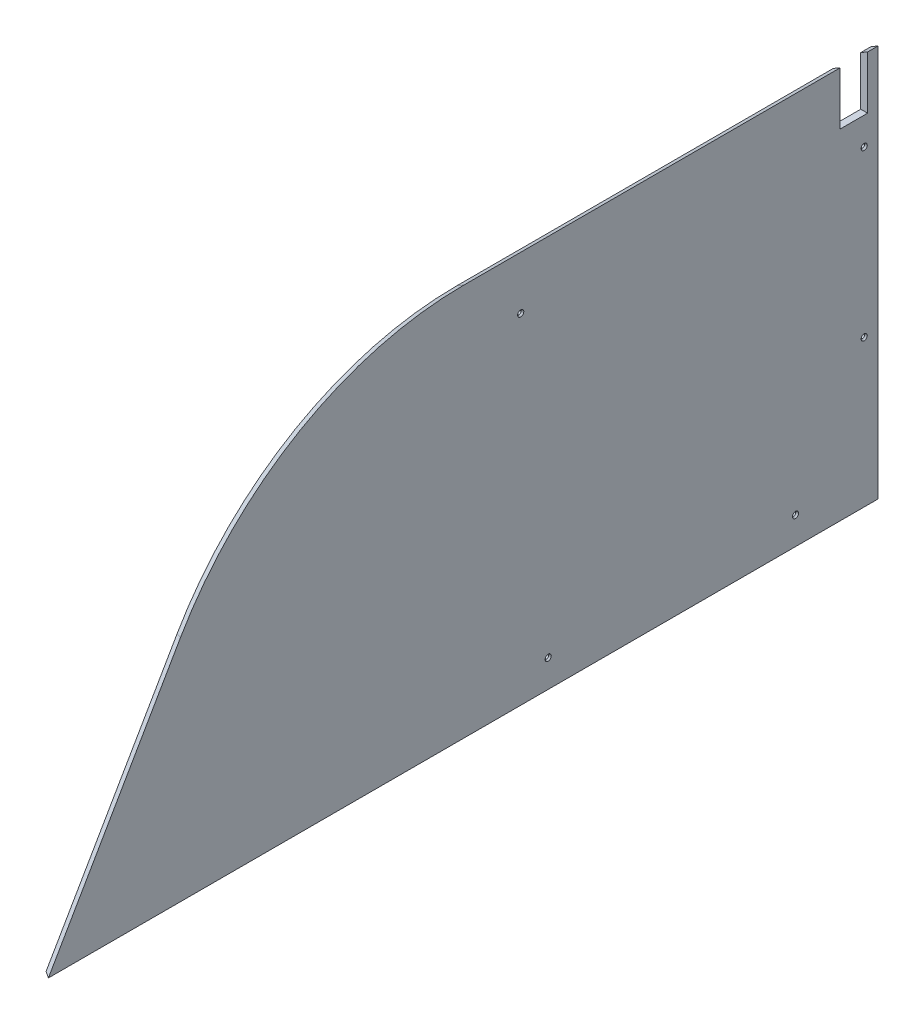
ISO-10303-21;
HEADER;
FILE_DESCRIPTION(('STEP AP214'),'2;1');
FILE_NAME('part.step','',(''),(''),'','','');
FILE_SCHEMA(('AUTOMOTIVE_DESIGN { 1 0 10303 214 1 1 1 1 }'));
ENDSEC;
DATA;
#1=APPLICATION_CONTEXT('core data for automotive mechanical design processes');
#2=APPLICATION_PROTOCOL_DEFINITION('international standard','automotive_design',2000,#1);
#3=PRODUCT_CONTEXT('',#1,'mechanical');
#4=PRODUCT('Part','Part','',(#3));
#5=PRODUCT_RELATED_PRODUCT_CATEGORY('part','',(#4));
#6=PRODUCT_DEFINITION_FORMATION('','',#4);
#7=PRODUCT_DEFINITION_CONTEXT('part definition',#1,'design');
#8=PRODUCT_DEFINITION('design','',#6,#7);
#9=PRODUCT_DEFINITION_SHAPE('','',#8);
#10=(LENGTH_UNIT() NAMED_UNIT(*) SI_UNIT(.MILLI.,.METRE.));
#11=(NAMED_UNIT(*) PLANE_ANGLE_UNIT() SI_UNIT($,.RADIAN.));
#12=(NAMED_UNIT(*) SI_UNIT($,.STERADIAN.) SOLID_ANGLE_UNIT());
#13=UNCERTAINTY_MEASURE_WITH_UNIT(LENGTH_MEASURE(1.E-05),#10,'distance_accuracy_value','');
#14=(GEOMETRIC_REPRESENTATION_CONTEXT(3) GLOBAL_UNCERTAINTY_ASSIGNED_CONTEXT((#13)) GLOBAL_UNIT_ASSIGNED_CONTEXT((#10,
#11,#12)) REPRESENTATION_CONTEXT('',''));
#15=CARTESIAN_POINT('',(0.,0.,0.));
#16=DIRECTION('',(0.,0.,1.));
#17=DIRECTION('',(1.,0.,0.));
#18=AXIS2_PLACEMENT_3D('',#15,#16,#17);
#19=CARTESIAN_POINT('',(10.5585817229401,258.962388375395,-263.265451077908));
#20=DIRECTION('',(-0.499999999999998,0.86602540378444,0.));
#21=DIRECTION('',(0.,0.,-1.));
#22=AXIS2_PLACEMENT_3D('',#19,#20,#21);
#23=PLANE('',#22);
#24=DIRECTION('',(0.86602540378444,0.499999999999998,0.));
#25=VECTOR('',#24,1.);
#26=CARTESIAN_POINT('',(1.58674999999998,253.782498915031,-636.56408902891));
#27=LINE('',#26,#25);
#28=CARTESIAN_POINT('',(0.,252.866388375395,-636.56408902891));
#29=VERTEX_POINT('',#28);
#30=CARTESIAN_POINT('',(6.35,256.532562584749,-636.56408902891));
#31=VERTEX_POINT('',#30);
#32=EDGE_CURVE('E109',#29,#31,#27,.T.);
#33=ORIENTED_EDGE('',*,*,#32,.T.);
#34=DIRECTION('',(0.,0.,1.));
#35=VECTOR('',#34,1.);
#36=CARTESIAN_POINT('',(6.35,256.532562584749,-263.265451077908));
#37=LINE('',#36,#35);
#38=CARTESIAN_POINT('',(6.35,256.532562584749,-646.08908902891));
#39=VERTEX_POINT('',#38);
#40=EDGE_CURVE('E190',#39,#31,#37,.T.);
#41=ORIENTED_EDGE('',*,*,#40,.F.);
#42=DIRECTION('',(0.86602540378444,0.499999999999998,0.));
#43=VECTOR('',#42,1.);
#44=CARTESIAN_POINT('',(10.5585817229401,258.962388375395,-646.08908902891));
#45=LINE('',#44,#43);
#46=CARTESIAN_POINT('',(0.,252.866388375395,-646.08908902891));
#47=VERTEX_POINT('',#46);
#48=EDGE_CURVE('E11',#47,#39,#45,.T.);
#49=ORIENTED_EDGE('',*,*,#48,.F.);
#50=DIRECTION('',(0.,0.,-1.));
#51=VECTOR('',#50,1.);
#52=CARTESIAN_POINT('',(0.,252.866388375395,-646.08908902891));
#53=LINE('',#52,#51);
#54=EDGE_CURVE('E128',#29,#47,#53,.T.);
#55=ORIENTED_EDGE('',*,*,#54,.F.);
#56=EDGE_LOOP('',(#33,#41,#49,#55));
#57=FACE_BOUND('',#56,.T.);
#58=ADVANCED_FACE('F35',(#57),#23,.T.);
#59=CARTESIAN_POINT('',(6.35,-106.162611624605,123.515928008951));
#60=DIRECTION('',(0.,1.,0.));
#61=DIRECTION('',(0.,0.,1.));
#62=AXIS2_PLACEMENT_3D('',#59,#60,#61);
#63=PLANE('',#62);
#64=DIRECTION('',(0.,0.,-1.));
#65=VECTOR('',#64,1.);
#66=CARTESIAN_POINT('',(6.35,-106.162611624605,123.515928008951));
#67=LINE('',#66,#65);
#68=CARTESIAN_POINT('',(6.35,-106.162611624605,120.710206860324));
#69=VERTEX_POINT('',#68);
#70=CARTESIAN_POINT('',(6.35,-106.162611624605,-646.08908902891));
#71=VERTEX_POINT('',#70);
#72=EDGE_CURVE('E178',#69,#71,#67,.T.);
#73=ORIENTED_EDGE('',*,*,#72,.F.);
#74=DIRECTION('',(-0.832050294337845,0.,-0.554700196225227));
#75=VECTOR('',#74,1.);
#76=CARTESIAN_POINT('',(10.5585817229401,-106.162611624605,123.515928008951));
#77=LINE('',#76,#75);
#78=CARTESIAN_POINT('',(0.,-106.162611624605,116.476873526991));
#79=VERTEX_POINT('',#78);
#80=EDGE_CURVE('E133',#69,#79,#77,.T.);
#81=ORIENTED_EDGE('',*,*,#80,.T.);
#82=DIRECTION('',(0.,0.,-1.));
#83=VECTOR('',#82,1.);
#84=CARTESIAN_POINT('',(0.,-106.162611624605,123.515928008951));
#85=LINE('',#84,#83);
#86=CARTESIAN_POINT('',(0.,-106.162611624605,-646.08908902891));
#87=VERTEX_POINT('',#86);
#88=EDGE_CURVE('E177',#79,#87,#85,.T.);
#89=ORIENTED_EDGE('',*,*,#88,.T.);
#90=DIRECTION('',(-1.,0.,0.));
#91=VECTOR('',#90,1.);
#92=CARTESIAN_POINT('',(6.35,-106.162611624605,-646.08908902891));
#93=LINE('',#92,#91);
#94=EDGE_CURVE('E184',#71,#87,#93,.T.);
#95=ORIENTED_EDGE('',*,*,#94,.F.);
#96=EDGE_LOOP('',(#73,#81,#89,#95));
#97=FACE_BOUND('',#96,.T.);
#98=ADVANCED_FACE('F200',(#97),#63,.F.);
#99=CARTESIAN_POINT('',(6.35,258.962388375395,-646.08908902891));
#100=DIRECTION('',(0.,0.,1.));
#101=DIRECTION('',(1.,0.,0.));
#102=AXIS2_PLACEMENT_3D('',#99,#100,#101);
#103=PLANE('',#102);
#104=DIRECTION('',(0.,1.,0.));
#105=VECTOR('',#104,1.);
#106=CARTESIAN_POINT('',(0.,258.962388375395,-646.08908902891));
#107=LINE('',#106,#105);
#108=EDGE_CURVE('E181',#87,#47,#107,.T.);
#109=ORIENTED_EDGE('',*,*,#108,.T.);
#110=ORIENTED_EDGE('',*,*,#48,.T.);
#111=DIRECTION('',(0.,1.,0.));
#112=VECTOR('',#111,1.);
#113=CARTESIAN_POINT('',(6.35,258.962388375395,-646.08908902891));
#114=LINE('',#113,#112);
#115=EDGE_CURVE('E180',#71,#39,#114,.T.);
#116=ORIENTED_EDGE('',*,*,#115,.F.);
#117=ORIENTED_EDGE('',*,*,#94,.T.);
#118=EDGE_LOOP('',(#109,#110,#116,#117));
#119=FACE_BOUND('',#118,.T.);
#120=ADVANCED_FACE('F206',(#119),#103,.F.);
#121=CARTESIAN_POINT('',(6.35,-45.837611624606,-263.265451077908));
#122=DIRECTION('',(-1.,0.,0.));
#123=DIRECTION('',(0.,0.,1.));
#124=AXIS2_PLACEMENT_3D('',#121,#122,#123);
#125=PLANE('',#124);
#126=CARTESIAN_POINT('',(6.35,-80.7626116246052,-569.88908902891));
#127=DIRECTION('',(1.,0.,0.));
#128=DIRECTION('',(0.,0.,-1.));
#129=AXIS2_PLACEMENT_3D('',#126,#127,#128);
#130=CIRCLE('',#129,2.8575);
#131=CARTESIAN_POINT('',(6.35,-80.7626116246052,-572.74658902891));
#132=VERTEX_POINT('',#131);
#133=EDGE_CURVE('E300',#132,#132,#130,.T.);
#134=ORIENTED_EDGE('',*,*,#133,.F.);
#135=EDGE_LOOP('',(#134));
#136=FACE_BOUND('',#135,.T.);
#137=CARTESIAN_POINT('',(6.35,-80.7626116246052,-341.28908902891));
#138=DIRECTION('',(1.,0.,0.));
#139=DIRECTION('',(0.,0.,-1.));
#140=AXIS2_PLACEMENT_3D('',#137,#138,#139);
#141=CIRCLE('',#140,2.8575);
#142=CARTESIAN_POINT('',(6.35,-80.7626116246052,-344.14658902891));
#143=VERTEX_POINT('',#142);
#144=EDGE_CURVE('E307',#143,#143,#141,.T.);
#145=ORIENTED_EDGE('',*,*,#144,.F.);
#146=EDGE_LOOP('',(#145));
#147=FACE_BOUND('',#146,.T.);
#148=CARTESIAN_POINT('',(6.35,207.527388375395,-315.88908902891));
#149=DIRECTION('',(1.,0.,0.));
#150=DIRECTION('',(0.,0.,-1.));
#151=AXIS2_PLACEMENT_3D('',#148,#149,#150);
#152=CIRCLE('',#151,2.85750000000001);
#153=CARTESIAN_POINT('',(6.35,207.527388375395,-318.74658902891));
#154=VERTEX_POINT('',#153);
#155=EDGE_CURVE('E144',#154,#154,#152,.T.);
#156=ORIENTED_EDGE('',*,*,#155,.F.);
#157=EDGE_LOOP('',(#156));
#158=FACE_BOUND('',#157,.T.);
#159=CARTESIAN_POINT('',(6.35,182.127388375395,-633.38908902891));
#160=DIRECTION('',(1.,0.,0.));
#161=DIRECTION('',(0.,0.,-1.));
#162=AXIS2_PLACEMENT_3D('',#159,#160,#161);
#163=CIRCLE('',#162,2.85750000000001);
#164=CARTESIAN_POINT('',(6.35,182.127388375395,-636.24658902891));
#165=VERTEX_POINT('',#164);
#166=EDGE_CURVE('E159',#165,#165,#163,.T.);
#167=ORIENTED_EDGE('',*,*,#166,.F.);
#168=EDGE_LOOP('',(#167));
#169=FACE_BOUND('',#168,.T.);
#170=CARTESIAN_POINT('',(6.35,29.7273883753948,-633.38908902891));
#171=DIRECTION('',(1.,0.,0.));
#172=DIRECTION('',(0.,0.,-1.));
#173=AXIS2_PLACEMENT_3D('',#170,#171,#172);
#174=CIRCLE('',#173,2.8575);
#175=CARTESIAN_POINT('',(6.35,29.7273883753948,-636.24658902891));
#176=VERTEX_POINT('',#175);
#177=EDGE_CURVE('E168',#176,#176,#174,.T.);
#178=ORIENTED_EDGE('',*,*,#177,.F.);
#179=EDGE_LOOP('',(#178));
#180=FACE_BOUND('',#179,.T.);
#181=ORIENTED_EDGE('',*,*,#40,.T.);
#182=DIRECTION('',(0.,1.,0.));
#183=VECTOR('',#182,1.);
#184=CARTESIAN_POINT('',(6.35,256.532562584749,-636.56408902891));
#185=LINE('',#184,#183);
#186=CARTESIAN_POINT('',(6.35,207.527388375395,-636.56408902891));
#187=VERTEX_POINT('',#186);
#188=EDGE_CURVE('E115',#187,#31,#185,.T.);
#189=ORIENTED_EDGE('',*,*,#188,.F.);
#190=DIRECTION('',(0.,0.,-1.));
#191=VECTOR('',#190,1.);
#192=CARTESIAN_POINT('',(6.35,207.527388375395,-636.56408902891));
#193=LINE('',#192,#191);
#194=CARTESIAN_POINT('',(6.35,207.527388375395,-611.16408902891));
#195=VERTEX_POINT('',#194);
#196=EDGE_CURVE('E210',#195,#187,#193,.T.);
#197=ORIENTED_EDGE('',*,*,#196,.F.);
#198=DIRECTION('',(0.,-1.,0.));
#199=VECTOR('',#198,1.);
#200=CARTESIAN_POINT('',(6.35,256.532562584749,-611.16408902891));
#201=LINE('',#200,#199);
#202=CARTESIAN_POINT('',(6.35,256.532562584749,-611.16408902891));
#203=VERTEX_POINT('',#202);
#204=EDGE_CURVE('E211',#203,#195,#201,.T.);
#205=ORIENTED_EDGE('',*,*,#204,.F.);
#206=CARTESIAN_POINT('',(6.35,256.532562584749,-263.265451077908));
#207=VERTEX_POINT('',#206);
#208=EDGE_CURVE('E189',#203,#207,#37,.T.);
#209=ORIENTED_EDGE('',*,*,#208,.T.);
#210=CARTESIAN_POINT('',(6.35,-45.837611624606,-263.265451077908));
#211=DIRECTION('',(-1.,0.,0.));
#212=DIRECTION('',(0.,0.,1.));
#213=AXIS2_PLACEMENT_3D('',#210,#211,#212);
#214=CIRCLE('',#213,302.370174209355);
#215=CARTESIAN_POINT('',(6.35,105.347475480071,-1.40519886588096));
#216=VERTEX_POINT('',#215);
#217=EDGE_CURVE('E192',#207,#216,#214,.F.);
#218=ORIENTED_EDGE('',*,*,#217,.T.);
#219=DIRECTION('',(0.,-0.86602540378444,0.499999999999998));
#220=VECTOR('',#219,1.);
#221=CARTESIAN_POINT('',(6.35,-107.377524519928,121.411637147481));
#222=LINE('',#221,#220);
#223=EDGE_CURVE('E137',#216,#69,#222,.T.);
#224=ORIENTED_EDGE('',*,*,#223,.T.);
#225=ORIENTED_EDGE('',*,*,#72,.T.);
#226=ORIENTED_EDGE('',*,*,#115,.T.);
#227=EDGE_LOOP('',(#181,#189,#197,#205,#209,#218,#224,#225,#226));
#228=FACE_BOUND('',#227,.T.);
#229=ADVANCED_FACE('F195',(#136,#147,#158,#169,#180,#228),#125,.F.);
#230=CARTESIAN_POINT('',(0.,-45.837611624606,-263.265451077908));
#231=DIRECTION('',(-1.,0.,0.));
#232=DIRECTION('',(0.,0.,1.));
#233=AXIS2_PLACEMENT_3D('',#230,#231,#232);
#234=PLANE('',#233);
#235=CARTESIAN_POINT('',(0.,-80.7626116246052,-569.88908902891));
#236=DIRECTION('',(1.,0.,0.));
#237=DIRECTION('',(0.,0.,-1.));
#238=AXIS2_PLACEMENT_3D('',#235,#236,#237);
#239=CIRCLE('',#238,1.63194999999999);
#240=CARTESIAN_POINT('',(0.,-80.7626116246052,-571.52103902891));
#241=VERTEX_POINT('',#240);
#242=EDGE_CURVE('E302',#241,#241,#239,.T.);
#243=ORIENTED_EDGE('',*,*,#242,.T.);
#244=EDGE_LOOP('',(#243));
#245=FACE_BOUND('',#244,.T.);
#246=CARTESIAN_POINT('',(0.,-80.7626116246052,-341.28908902891));
#247=DIRECTION('',(1.,0.,0.));
#248=DIRECTION('',(0.,0.,-1.));
#249=AXIS2_PLACEMENT_3D('',#246,#247,#248);
#250=CIRCLE('',#249,1.63194999999999);
#251=CARTESIAN_POINT('',(0.,-80.7626116246052,-342.92103902891));
#252=VERTEX_POINT('',#251);
#253=EDGE_CURVE('E313',#252,#252,#250,.T.);
#254=ORIENTED_EDGE('',*,*,#253,.T.);
#255=EDGE_LOOP('',(#254));
#256=FACE_BOUND('',#255,.T.);
#257=DIRECTION('',(0.,1.,0.));
#258=VECTOR('',#257,1.);
#259=CARTESIAN_POINT('',(0.,256.532562584749,-636.56408902891));
#260=LINE('',#259,#258);
#261=CARTESIAN_POINT('',(0.,207.527388375395,-636.56408902891));
#262=VERTEX_POINT('',#261);
#263=EDGE_CURVE('E112',#262,#29,#260,.T.);
#264=ORIENTED_EDGE('',*,*,#263,.T.);
#265=ORIENTED_EDGE('',*,*,#54,.T.);
#266=ORIENTED_EDGE('',*,*,#108,.F.);
#267=ORIENTED_EDGE('',*,*,#88,.F.);
#268=DIRECTION('',(0.,0.86602540378444,-0.499999999999998));
#269=VECTOR('',#268,1.);
#270=CARTESIAN_POINT('',(0.,103.514388375394,-4.5801988658809));
#271=LINE('',#270,#269);
#272=CARTESIAN_POINT('',(0.,103.514388375394,-4.58019886588051));
#273=VERTEX_POINT('',#272);
#274=EDGE_CURVE('E44',#79,#273,#271,.T.);
#275=ORIENTED_EDGE('',*,*,#274,.T.);
#276=CARTESIAN_POINT('',(0.,-45.837611624606,-263.265451077908));
#277=DIRECTION('',(-1.,0.,0.));
#278=DIRECTION('',(0.,0.,1.));
#279=AXIS2_PLACEMENT_3D('',#276,#277,#278);
#280=CIRCLE('',#279,298.704);
#281=CARTESIAN_POINT('',(0.,252.866388375395,-263.265451077908));
#282=VERTEX_POINT('',#281);
#283=EDGE_CURVE('E136',#273,#282,#280,.T.);
#284=ORIENTED_EDGE('',*,*,#283,.T.);
#285=CARTESIAN_POINT('',(0.,252.866388375395,-611.16408902891));
#286=VERTEX_POINT('',#285);
#287=EDGE_CURVE('E132',#282,#286,#53,.T.);
#288=ORIENTED_EDGE('',*,*,#287,.T.);
#289=DIRECTION('',(0.,-1.,0.));
#290=VECTOR('',#289,1.);
#291=CARTESIAN_POINT('',(0.,256.532562584749,-611.16408902891));
#292=LINE('',#291,#290);
#293=CARTESIAN_POINT('',(0.,207.527388375395,-611.16408902891));
#294=VERTEX_POINT('',#293);
#295=EDGE_CURVE('E52',#286,#294,#292,.T.);
#296=ORIENTED_EDGE('',*,*,#295,.T.);
#297=DIRECTION('',(0.,0.,-1.));
#298=VECTOR('',#297,1.);
#299=CARTESIAN_POINT('',(0.,207.527388375395,-636.56408902891));
#300=LINE('',#299,#298);
#301=EDGE_CURVE('E120',#294,#262,#300,.T.);
#302=ORIENTED_EDGE('',*,*,#301,.T.);
#303=EDGE_LOOP('',(#264,#265,#266,#267,#275,#284,#288,#296,#302));
#304=FACE_BOUND('',#303,.T.);
#305=CARTESIAN_POINT('',(0.,207.527388375395,-315.88908902891));
#306=DIRECTION('',(1.,0.,0.));
#307=DIRECTION('',(0.,0.,-1.));
#308=AXIS2_PLACEMENT_3D('',#305,#306,#307);
#309=CIRCLE('',#308,1.63194999999999);
#310=CARTESIAN_POINT('',(0.,207.527388375395,-317.52103902891));
#311=VERTEX_POINT('',#310);
#312=EDGE_CURVE('E156',#311,#311,#309,.T.);
#313=ORIENTED_EDGE('',*,*,#312,.T.);
#314=EDGE_LOOP('',(#313));
#315=FACE_BOUND('',#314,.T.);
#316=CARTESIAN_POINT('',(0.,182.127388375395,-633.38908902891));
#317=DIRECTION('',(1.,0.,0.));
#318=DIRECTION('',(0.,0.,-1.));
#319=AXIS2_PLACEMENT_3D('',#316,#317,#318);
#320=CIRCLE('',#319,1.63194999999999);
#321=CARTESIAN_POINT('',(0.,182.127388375395,-635.02103902891));
#322=VERTEX_POINT('',#321);
#323=EDGE_CURVE('E165',#322,#322,#320,.T.);
#324=ORIENTED_EDGE('',*,*,#323,.T.);
#325=EDGE_LOOP('',(#324));
#326=FACE_BOUND('',#325,.T.);
#327=CARTESIAN_POINT('',(0.,29.7273883753948,-633.38908902891));
#328=DIRECTION('',(1.,0.,0.));
#329=DIRECTION('',(0.,0.,-1.));
#330=AXIS2_PLACEMENT_3D('',#327,#328,#329);
#331=CIRCLE('',#330,1.63194999999999);
#332=CARTESIAN_POINT('',(0.,29.7273883753948,-635.02103902891));
#333=VERTEX_POINT('',#332);
#334=EDGE_CURVE('E174',#333,#333,#331,.T.);
#335=ORIENTED_EDGE('',*,*,#334,.T.);
#336=EDGE_LOOP('',(#335));
#337=FACE_BOUND('',#336,.T.);
#338=ADVANCED_FACE('F125',(#245,#256,#304,#315,#326,#337),#234,.T.);
#339=CARTESIAN_POINT('',(6.35,29.7273883753948,-633.38908902891));
#340=DIRECTION('',(1.,0.,0.));
#341=DIRECTION('',(0.,0.,-1.));
#342=AXIS2_PLACEMENT_3D('',#339,#340,#341);
#343=CYLINDRICAL_SURFACE('',#342,1.63194999999999);
#344=ORIENTED_EDGE('',*,*,#334,.F.);
#345=EDGE_LOOP('',(#344));
#346=FACE_BOUND('',#345,.T.);
#347=CARTESIAN_POINT('',(4.94016599853029,29.7273883753948,-633.38908902891));
#348=DIRECTION('',(1.,0.,0.));
#349=DIRECTION('',(0.,0.,-1.));
#350=AXIS2_PLACEMENT_3D('',#347,#348,#349);
#351=CIRCLE('',#350,1.63195);
#352=CARTESIAN_POINT('',(4.94016599853029,29.7273883753948,-635.02103902891));
#353=VERTEX_POINT('',#352);
#354=EDGE_CURVE('E171',#353,#353,#351,.T.);
#355=ORIENTED_EDGE('',*,*,#354,.T.);
#356=EDGE_LOOP('',(#355));
#357=FACE_BOUND('',#356,.T.);
#358=ADVANCED_FACE('F244',(#346,#357),#343,.F.);
#359=CARTESIAN_POINT('',(6.35,29.7273883753948,-633.38908902891));
#360=DIRECTION('',(1.,0.,0.));
#361=DIRECTION('',(0.,0.,-1.));
#362=AXIS2_PLACEMENT_3D('',#359,#360,#361);
#363=CONICAL_SURFACE('',#362,2.8575,0.715584993317674);
#364=ORIENTED_EDGE('',*,*,#354,.F.);
#365=EDGE_LOOP('',(#364));
#366=FACE_BOUND('',#365,.T.);
#367=ORIENTED_EDGE('',*,*,#177,.T.);
#368=EDGE_LOOP('',(#367));
#369=FACE_BOUND('',#368,.T.);
#370=ADVANCED_FACE('F251',(#366,#369),#363,.F.);
#371=CARTESIAN_POINT('',(6.35,182.127388375395,-633.38908902891));
#372=DIRECTION('',(1.,0.,0.));
#373=DIRECTION('',(0.,0.,-1.));
#374=AXIS2_PLACEMENT_3D('',#371,#372,#373);
#375=CYLINDRICAL_SURFACE('',#374,1.63194999999999);
#376=ORIENTED_EDGE('',*,*,#323,.F.);
#377=EDGE_LOOP('',(#376));
#378=FACE_BOUND('',#377,.T.);
#379=CARTESIAN_POINT('',(4.94016599853029,182.127388375395,-633.38908902891));
#380=DIRECTION('',(1.,0.,0.));
#381=DIRECTION('',(0.,0.,-1.));
#382=AXIS2_PLACEMENT_3D('',#379,#380,#381);
#383=CIRCLE('',#382,1.63194999999999);
#384=CARTESIAN_POINT('',(4.94016599853029,182.127388375395,-635.02103902891));
#385=VERTEX_POINT('',#384);
#386=EDGE_CURVE('E162',#385,#385,#383,.T.);
#387=ORIENTED_EDGE('',*,*,#386,.T.);
#388=EDGE_LOOP('',(#387));
#389=FACE_BOUND('',#388,.T.);
#390=ADVANCED_FACE('F255',(#378,#389),#375,.F.);
#391=CARTESIAN_POINT('',(6.35,182.127388375395,-633.38908902891));
#392=DIRECTION('',(1.,0.,0.));
#393=DIRECTION('',(0.,0.,-1.));
#394=AXIS2_PLACEMENT_3D('',#391,#392,#393);
#395=CONICAL_SURFACE('',#394,2.85750000000001,0.715584993317682);
#396=ORIENTED_EDGE('',*,*,#386,.F.);
#397=EDGE_LOOP('',(#396));
#398=FACE_BOUND('',#397,.T.);
#399=ORIENTED_EDGE('',*,*,#166,.T.);
#400=EDGE_LOOP('',(#399));
#401=FACE_BOUND('',#400,.T.);
#402=ADVANCED_FACE('F259',(#398,#401),#395,.F.);
#403=CARTESIAN_POINT('',(6.35,207.527388375395,-315.88908902891));
#404=DIRECTION('',(1.,0.,0.));
#405=DIRECTION('',(0.,0.,-1.));
#406=AXIS2_PLACEMENT_3D('',#403,#404,#405);
#407=CYLINDRICAL_SURFACE('',#406,1.63194999999999);
#408=ORIENTED_EDGE('',*,*,#312,.F.);
#409=EDGE_LOOP('',(#408));
#410=FACE_BOUND('',#409,.T.);
#411=CARTESIAN_POINT('',(4.94016599853029,207.527388375395,-315.88908902891));
#412=DIRECTION('',(1.,0.,0.));
#413=DIRECTION('',(0.,0.,-1.));
#414=AXIS2_PLACEMENT_3D('',#411,#412,#413);
#415=CIRCLE('',#414,1.63194999999999);
#416=CARTESIAN_POINT('',(4.94016599853029,207.527388375395,-317.52103902891));
#417=VERTEX_POINT('',#416);
#418=EDGE_CURVE('E153',#417,#417,#415,.T.);
#419=ORIENTED_EDGE('',*,*,#418,.T.);
#420=EDGE_LOOP('',(#419));
#421=FACE_BOUND('',#420,.T.);
#422=ADVANCED_FACE('F263',(#410,#421),#407,.F.);
#423=CARTESIAN_POINT('',(6.35,207.527388375395,-315.88908902891));
#424=DIRECTION('',(1.,0.,0.));
#425=DIRECTION('',(0.,0.,-1.));
#426=AXIS2_PLACEMENT_3D('',#423,#424,#425);
#427=CONICAL_SURFACE('',#426,2.85750000000001,0.715584993317682);
#428=ORIENTED_EDGE('',*,*,#418,.F.);
#429=EDGE_LOOP('',(#428));
#430=FACE_BOUND('',#429,.T.);
#431=ORIENTED_EDGE('',*,*,#155,.T.);
#432=EDGE_LOOP('',(#431));
#433=FACE_BOUND('',#432,.T.);
#434=ADVANCED_FACE('F231',(#430,#433),#427,.F.);
#435=DIRECTION('',(-0.86602540378444,-0.499999999999998,0.));
#436=VECTOR('',#435,1.);
#437=CARTESIAN_POINT('',(1.58674999999998,253.782498915031,-611.16408902891));
#438=LINE('',#437,#436);
#439=EDGE_CURVE('E121',#203,#286,#438,.T.);
#440=ORIENTED_EDGE('',*,*,#439,.T.);
#441=ORIENTED_EDGE('',*,*,#287,.F.);
#442=DIRECTION('',(-0.86602540378444,-0.499999999999998,0.));
#443=VECTOR('',#442,1.);
#444=CARTESIAN_POINT('',(10.5585817229401,258.962388375395,-263.265451077908));
#445=LINE('',#444,#443);
#446=EDGE_CURVE('E39',#207,#282,#445,.T.);
#447=ORIENTED_EDGE('',*,*,#446,.F.);
#448=ORIENTED_EDGE('',*,*,#208,.F.);
#449=EDGE_LOOP('',(#440,#441,#447,#448));
#450=FACE_BOUND('',#449,.T.);
#451=ADVANCED_FACE('F37',(#450),#23,.T.);
#452=CARTESIAN_POINT('',(10.5585817229401,-45.837611624606,-263.265451077908));
#453=DIRECTION('',(1.,0.,0.));
#454=DIRECTION('',(0.,0.,-1.));
#455=AXIS2_PLACEMENT_3D('',#452,#453,#454);
#456=CONICAL_SURFACE('',#455,304.8,0.523598775598293);
#457=ORIENTED_EDGE('',*,*,#446,.T.);
#458=ORIENTED_EDGE('',*,*,#283,.F.);
#459=DIRECTION('',(-0.866025403784443,-0.249999999999996,-0.433012701892213));
#460=VECTOR('',#459,1.);
#461=CARTESIAN_POINT('',(10.5585817229401,106.562388375394,0.69909199558944));
#462=LINE('',#461,#460);
#463=EDGE_CURVE('E60',#216,#273,#462,.T.);
#464=ORIENTED_EDGE('',*,*,#463,.F.);
#465=ORIENTED_EDGE('',*,*,#217,.F.);
#466=EDGE_LOOP('',(#457,#458,#464,#465));
#467=FACE_BOUND('',#466,.T.);
#468=ADVANCED_FACE('F224',(#467),#456,.T.);
#469=CARTESIAN_POINT('',(10.5585817229401,-106.162611624605,123.515928008951));
#470=DIRECTION('',(-0.499999999999999,0.433012701892218,0.750000000000002));
#471=DIRECTION('',(0.,0.86602540378444,-0.499999999999998));
#472=AXIS2_PLACEMENT_3D('',#469,#470,#471);
#473=PLANE('',#472);
#474=ORIENTED_EDGE('',*,*,#463,.T.);
#475=ORIENTED_EDGE('',*,*,#274,.F.);
#476=ORIENTED_EDGE('',*,*,#80,.F.);
#477=ORIENTED_EDGE('',*,*,#223,.F.);
#478=EDGE_LOOP('',(#474,#475,#476,#477));
#479=FACE_BOUND('',#478,.T.);
#480=ADVANCED_FACE('F203',(#479),#473,.T.);
#481=CARTESIAN_POINT('',(-0.00100000000000881,256.532562584749,-636.56408902891));
#482=DIRECTION('',(0.,0.,-1.));
#483=DIRECTION('',(-1.,0.,0.));
#484=AXIS2_PLACEMENT_3D('',#481,#482,#483);
#485=PLANE('',#484);
#486=DIRECTION('',(1.,0.,0.));
#487=VECTOR('',#486,1.);
#488=CARTESIAN_POINT('',(-0.00100000000000881,207.527388375395,-636.56408902891));
#489=LINE('',#488,#487);
#490=EDGE_CURVE('E145',#262,#187,#489,.T.);
#491=ORIENTED_EDGE('',*,*,#490,.T.);
#492=ORIENTED_EDGE('',*,*,#188,.T.);
#493=ORIENTED_EDGE('',*,*,#32,.F.);
#494=ORIENTED_EDGE('',*,*,#263,.F.);
#495=EDGE_LOOP('',(#491,#492,#493,#494));
#496=FACE_BOUND('',#495,.T.);
#497=ADVANCED_FACE('F111',(#496),#485,.F.);
#498=CARTESIAN_POINT('',(-0.00100000000000881,207.527388375395,-636.56408902891));
#499=DIRECTION('',(0.,-1.,0.));
#500=DIRECTION('',(0.,0.,-1.));
#501=AXIS2_PLACEMENT_3D('',#498,#499,#500);
#502=PLANE('',#501);
#503=DIRECTION('',(1.,0.,0.));
#504=VECTOR('',#503,1.);
#505=CARTESIAN_POINT('',(-0.00100000000000881,207.527388375395,-611.16408902891));
#506=LINE('',#505,#504);
#507=EDGE_CURVE('E147',#294,#195,#506,.T.);
#508=ORIENTED_EDGE('',*,*,#507,.T.);
#509=ORIENTED_EDGE('',*,*,#196,.T.);
#510=ORIENTED_EDGE('',*,*,#490,.F.);
#511=ORIENTED_EDGE('',*,*,#301,.F.);
#512=EDGE_LOOP('',(#508,#509,#510,#511));
#513=FACE_BOUND('',#512,.T.);
#514=ADVANCED_FACE('F218',(#513),#502,.F.);
#515=CARTESIAN_POINT('',(-0.00100000000000881,256.532562584749,-611.16408902891));
#516=DIRECTION('',(0.,0.,1.));
#517=DIRECTION('',(1.,0.,0.));
#518=AXIS2_PLACEMENT_3D('',#515,#516,#517);
#519=PLANE('',#518);
#520=ORIENTED_EDGE('',*,*,#439,.F.);
#521=ORIENTED_EDGE('',*,*,#204,.T.);
#522=ORIENTED_EDGE('',*,*,#507,.F.);
#523=ORIENTED_EDGE('',*,*,#295,.F.);
#524=EDGE_LOOP('',(#520,#521,#522,#523));
#525=FACE_BOUND('',#524,.T.);
#526=ADVANCED_FACE('F219',(#525),#519,.F.);
#527=CARTESIAN_POINT('',(6.35,-80.7626116246052,-341.28908902891));
#528=DIRECTION('',(1.,0.,0.));
#529=DIRECTION('',(0.,0.,-1.));
#530=AXIS2_PLACEMENT_3D('',#527,#528,#529);
#531=CYLINDRICAL_SURFACE('',#530,1.63194999999999);
#532=ORIENTED_EDGE('',*,*,#253,.F.);
#533=EDGE_LOOP('',(#532));
#534=FACE_BOUND('',#533,.T.);
#535=CARTESIAN_POINT('',(4.94016599853026,-80.7626116246052,-341.28908902891));
#536=DIRECTION('',(1.,0.,0.));
#537=DIRECTION('',(0.,0.,-1.));
#538=AXIS2_PLACEMENT_3D('',#535,#536,#537);
#539=CIRCLE('',#538,1.63194999999999);
#540=CARTESIAN_POINT('',(4.94016599853026,-80.7626116246052,-342.92103902891));
#541=VERTEX_POINT('',#540);
#542=EDGE_CURVE('E310',#541,#541,#539,.T.);
#543=ORIENTED_EDGE('',*,*,#542,.T.);
#544=EDGE_LOOP('',(#543));
#545=FACE_BOUND('',#544,.T.);
#546=ADVANCED_FACE('F275',(#534,#545),#531,.F.);
#547=CARTESIAN_POINT('',(6.35,-80.7626116246052,-341.28908902891));
#548=DIRECTION('',(1.,0.,0.));
#549=DIRECTION('',(0.,0.,-1.));
#550=AXIS2_PLACEMENT_3D('',#547,#548,#549);
#551=CONICAL_SURFACE('',#550,2.8575,0.715584993317666);
#552=ORIENTED_EDGE('',*,*,#542,.F.);
#553=EDGE_LOOP('',(#552));
#554=FACE_BOUND('',#553,.T.);
#555=ORIENTED_EDGE('',*,*,#144,.T.);
#556=EDGE_LOOP('',(#555));
#557=FACE_BOUND('',#556,.T.);
#558=ADVANCED_FACE('F280',(#554,#557),#551,.F.);
#559=CARTESIAN_POINT('',(6.35,-80.7626116246052,-569.88908902891));
#560=DIRECTION('',(1.,0.,0.));
#561=DIRECTION('',(0.,0.,-1.));
#562=AXIS2_PLACEMENT_3D('',#559,#560,#561);
#563=CYLINDRICAL_SURFACE('',#562,1.63194999999999);
#564=ORIENTED_EDGE('',*,*,#242,.F.);
#565=EDGE_LOOP('',(#564));
#566=FACE_BOUND('',#565,.T.);
#567=CARTESIAN_POINT('',(4.94016599853026,-80.7626116246052,-569.88908902891));
#568=DIRECTION('',(1.,0.,0.));
#569=DIRECTION('',(0.,0.,-1.));
#570=AXIS2_PLACEMENT_3D('',#567,#568,#569);
#571=CIRCLE('',#570,1.63194999999999);
#572=CARTESIAN_POINT('',(4.94016599853026,-80.7626116246052,-571.52103902891));
#573=VERTEX_POINT('',#572);
#574=EDGE_CURVE('E297',#573,#573,#571,.T.);
#575=ORIENTED_EDGE('',*,*,#574,.T.);
#576=EDGE_LOOP('',(#575));
#577=FACE_BOUND('',#576,.T.);
#578=ADVANCED_FACE('F284',(#566,#577),#563,.F.);
#579=CARTESIAN_POINT('',(6.35,-80.7626116246052,-569.88908902891));
#580=DIRECTION('',(1.,0.,0.));
#581=DIRECTION('',(0.,0.,-1.));
#582=AXIS2_PLACEMENT_3D('',#579,#580,#581);
#583=CONICAL_SURFACE('',#582,2.8575,0.715584993317666);
#584=ORIENTED_EDGE('',*,*,#574,.F.);
#585=EDGE_LOOP('',(#584));
#586=FACE_BOUND('',#585,.T.);
#587=ORIENTED_EDGE('',*,*,#133,.T.);
#588=EDGE_LOOP('',(#587));
#589=FACE_BOUND('',#588,.T.);
#590=ADVANCED_FACE('F288',(#586,#589),#583,.F.);
#591=CLOSED_SHELL('',(#58,#98,#120,#229,#338,#358,#370,#390,#402,#422,#434,#451,#468,#480,#497,
#514,#526,#546,#558,#578,#590));
#592=MANIFOLD_SOLID_BREP('B2',#591);
#593=ADVANCED_BREP_SHAPE_REPRESENTATION('',(#18,#592),#14);
#594=SHAPE_DEFINITION_REPRESENTATION(#9,#593);
ENDSEC;
END-ISO-10303-21;
